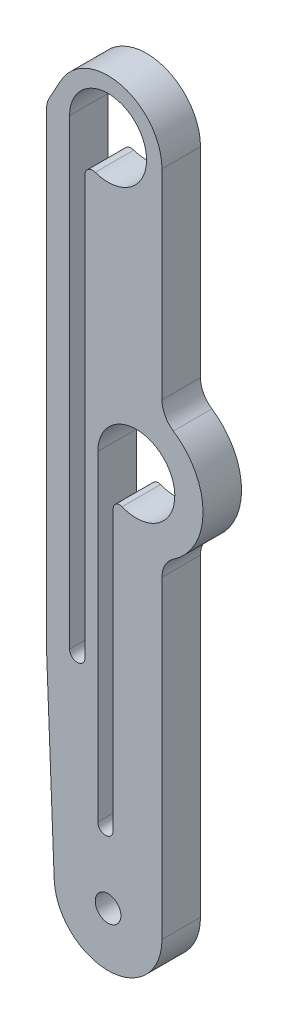
ISO-10303-21;
HEADER;
FILE_DESCRIPTION(('STEP AP214'),'2;1');
FILE_NAME('part.step','',(''),(''),'','','');
FILE_SCHEMA(('AUTOMOTIVE_DESIGN { 1 0 10303 214 1 1 1 1 }'));
ENDSEC;
DATA;
#1=APPLICATION_CONTEXT('core data for automotive mechanical design processes');
#2=APPLICATION_PROTOCOL_DEFINITION('international standard','automotive_design',2000,#1);
#3=PRODUCT_CONTEXT('',#1,'mechanical');
#4=PRODUCT('Part','Part','',(#3));
#5=PRODUCT_RELATED_PRODUCT_CATEGORY('part','',(#4));
#6=PRODUCT_DEFINITION_FORMATION('','',#4);
#7=PRODUCT_DEFINITION_CONTEXT('part definition',#1,'design');
#8=PRODUCT_DEFINITION('design','',#6,#7);
#9=PRODUCT_DEFINITION_SHAPE('','',#8);
#10=(LENGTH_UNIT() NAMED_UNIT(*) SI_UNIT(.MILLI.,.METRE.));
#11=(NAMED_UNIT(*) PLANE_ANGLE_UNIT() SI_UNIT($,.RADIAN.));
#12=(NAMED_UNIT(*) SI_UNIT($,.STERADIAN.) SOLID_ANGLE_UNIT());
#13=UNCERTAINTY_MEASURE_WITH_UNIT(LENGTH_MEASURE(1.E-05),#10,'distance_accuracy_value','');
#14=(GEOMETRIC_REPRESENTATION_CONTEXT(3) GLOBAL_UNCERTAINTY_ASSIGNED_CONTEXT((#13)) GLOBAL_UNIT_ASSIGNED_CONTEXT((#10,
#11,#12)) REPRESENTATION_CONTEXT('',''));
#15=CARTESIAN_POINT('',(0.,0.,0.));
#16=DIRECTION('',(0.,0.,1.));
#17=DIRECTION('',(1.,0.,0.));
#18=AXIS2_PLACEMENT_3D('',#15,#16,#17);
#19=CARTESIAN_POINT('',(-3.00172794621576,51.1319239030899,3.));
#20=DIRECTION('',(0.,0.,1.));
#21=DIRECTION('',(1.,0.,0.));
#22=AXIS2_PLACEMENT_3D('',#19,#20,#21);
#23=PLANE('',#22);
#24=DIRECTION('',(0.,-1.,0.));
#25=VECTOR('',#24,1.);
#26=CARTESIAN_POINT('',(-0.799999999999977,30.0333590932663,3.));
#27=LINE('',#26,#25);
#28=CARTESIAN_POINT('',(-0.799999999999977,30.0333590932663,3.));
#29=VERTEX_POINT('',#28);
#30=CARTESIAN_POINT('',(-0.799999999999977,5.03335909326628,3.));
#31=VERTEX_POINT('',#30);
#32=EDGE_CURVE('E186',#29,#31,#27,.T.);
#33=ORIENTED_EDGE('',*,*,#32,.F.);
#34=CARTESIAN_POINT('',(2.20000000000002,30.0333590932663,3.));
#35=DIRECTION('',(0.,0.,1.));
#36=DIRECTION('',(1.,0.,0.));
#37=AXIS2_PLACEMENT_3D('',#34,#35,#36);
#38=CIRCLE('',#37,3.);
#39=CARTESIAN_POINT('',(1.08571428571431,27.2479744973911,3.));
#40=VERTEX_POINT('',#39);
#41=EDGE_CURVE('E178',#40,#29,#38,.T.);
#42=ORIENTED_EDGE('',*,*,#41,.F.);
#43=CARTESIAN_POINT('',(0.900000000000023,26.7837437314119,3.));
#44=DIRECTION('',(0.,0.,-1.));
#45=DIRECTION('',(-1.,0.,0.));
#46=AXIS2_PLACEMENT_3D('',#43,#44,#45);
#47=CIRCLE('',#46,0.499999999999999);
#48=CARTESIAN_POINT('',(0.400000000000024,26.7837437314119,3.));
#49=VERTEX_POINT('',#48);
#50=EDGE_CURVE('E207',#49,#40,#47,.T.);
#51=ORIENTED_EDGE('',*,*,#50,.F.);
#52=DIRECTION('',(0.,1.,0.));
#53=VECTOR('',#52,1.);
#54=CARTESIAN_POINT('',(0.400000000000024,5.03335909326628,3.));
#55=LINE('',#54,#53);
#56=CARTESIAN_POINT('',(0.400000000000024,5.03335909326628,3.));
#57=VERTEX_POINT('',#56);
#58=EDGE_CURVE('E202',#57,#49,#55,.T.);
#59=ORIENTED_EDGE('',*,*,#58,.F.);
#60=CARTESIAN_POINT('',(-0.199999999999976,5.03335909326628,3.));
#61=DIRECTION('',(0.,0.,1.));
#62=DIRECTION('',(1.,0.,0.));
#63=AXIS2_PLACEMENT_3D('',#60,#61,#62);
#64=CIRCLE('',#63,0.600000000000001);
#65=EDGE_CURVE('E200',#31,#57,#64,.T.);
#66=ORIENTED_EDGE('',*,*,#65,.F.);
#67=EDGE_LOOP('',(#33,#42,#51,#59,#66));
#68=FACE_BOUND('',#67,.T.);
#69=DIRECTION('',(0.,1.,0.));
#70=VECTOR('',#69,1.);
#71=CARTESIAN_POINT('',(-1.79999999999998,15.6,3.));
#72=LINE('',#71,#70);
#73=CARTESIAN_POINT('',(-1.79999999999998,15.6,3.));
#74=VERTEX_POINT('',#73);
#75=CARTESIAN_POINT('',(-1.79999999999998,48.2058874503046,3.));
#76=VERTEX_POINT('',#75);
#77=EDGE_CURVE('E227',#74,#76,#72,.T.);
#78=ORIENTED_EDGE('',*,*,#77,.F.);
#79=CARTESIAN_POINT('',(-2.39999999999998,15.6,3.));
#80=DIRECTION('',(0.,0.,1.));
#81=DIRECTION('',(1.,0.,0.));
#82=AXIS2_PLACEMENT_3D('',#79,#80,#81);
#83=CIRCLE('',#82,0.600000000000001);
#84=CARTESIAN_POINT('',(-2.99999999999998,15.6,3.));
#85=VERTEX_POINT('',#84);
#86=EDGE_CURVE('E225',#85,#74,#83,.T.);
#87=ORIENTED_EDGE('',*,*,#86,.F.);
#88=DIRECTION('',(0.,-1.,0.));
#89=VECTOR('',#88,1.);
#90=CARTESIAN_POINT('',(-2.99999999999998,51.6,3.));
#91=LINE('',#90,#89);
#92=CARTESIAN_POINT('',(-2.99999999999998,51.6,3.));
#93=VERTEX_POINT('',#92);
#94=EDGE_CURVE('E235',#93,#85,#91,.T.);
#95=ORIENTED_EDGE('',*,*,#94,.F.);
#96=CARTESIAN_POINT('',(0.,51.6,3.));
#97=DIRECTION('',(0.,0.,1.));
#98=DIRECTION('',(1.,0.,0.));
#99=AXIS2_PLACEMENT_3D('',#96,#97,#98);
#100=CIRCLE('',#99,2.99999999999999);
#101=CARTESIAN_POINT('',(-0.999999999999981,48.7715728752538,3.));
#102=VERTEX_POINT('',#101);
#103=EDGE_CURVE('E232',#102,#93,#100,.T.);
#104=ORIENTED_EDGE('',*,*,#103,.F.);
#105=CARTESIAN_POINT('',(-1.19999999999998,48.2058874503046,3.));
#106=DIRECTION('',(0.,0.,-1.));
#107=DIRECTION('',(1.,0.,0.));
#108=AXIS2_PLACEMENT_3D('',#105,#106,#107);
#109=CIRCLE('',#108,0.6);
#110=EDGE_CURVE('E230',#76,#102,#109,.T.);
#111=ORIENTED_EDGE('',*,*,#110,.F.);
#112=EDGE_LOOP('',(#78,#87,#95,#104,#111));
#113=FACE_BOUND('',#112,.T.);
#114=CARTESIAN_POINT('',(-3.00172794621576,51.1319239030899,3.));
#115=DIRECTION('',(0.,0.,1.));
#116=DIRECTION('',(1.,0.,0.));
#117=AXIS2_PLACEMENT_3D('',#114,#115,#116);
#118=CIRCLE('',#117,1.8);
#119=CARTESIAN_POINT('',(-4.57481492065261,52.0067938196244,3.));
#120=VERTEX_POINT('',#119);
#121=CARTESIAN_POINT('',(-4.80172536810645,51.1349704071367,3.));
#122=VERTEX_POINT('',#121);
#123=EDGE_CURVE('E263',#120,#122,#118,.T.);
#124=ORIENTED_EDGE('',*,*,#123,.T.);
#125=DIRECTION('',(0.,-1.,0.));
#126=VECTOR('',#125,1.);
#127=CARTESIAN_POINT('',(-4.80172536810645,51.1349704071367,3.));
#128=LINE('',#127,#126);
#129=CARTESIAN_POINT('',(-4.80172536810645,14.8455166798283,3.));
#130=VERTEX_POINT('',#129);
#131=EDGE_CURVE('E266',#122,#130,#128,.T.);
#132=ORIENTED_EDGE('',*,*,#131,.T.);
#133=DIRECTION('',(0.0392265929449926,-0.999230341015488,0.));
#134=VECTOR('',#133,1.);
#135=CARTESIAN_POINT('',(-4.80172536810645,14.8455166798283,3.));
#136=LINE('',#135,#134);
#137=CARTESIAN_POINT('',(-4.19676743226505,-0.56475169036896,3.));
#138=VERTEX_POINT('',#137);
#139=EDGE_CURVE('E269',#130,#138,#136,.T.);
#140=ORIENTED_EDGE('',*,*,#139,.T.);
#141=CARTESIAN_POINT('',(0.,-0.399999999999998,3.));
#142=DIRECTION('',(0.,0.,1.));
#143=DIRECTION('',(1.,0.,0.));
#144=AXIS2_PLACEMENT_3D('',#141,#142,#143);
#145=CIRCLE('',#144,4.2);
#146=CARTESIAN_POINT('',(4.2,-0.399999999999998,3.));
#147=VERTEX_POINT('',#146);
#148=EDGE_CURVE('E271',#138,#147,#145,.T.);
#149=ORIENTED_EDGE('',*,*,#148,.T.);
#150=DIRECTION('',(0.,1.,0.));
#151=VECTOR('',#150,1.);
#152=CARTESIAN_POINT('',(4.2,-0.399999999999991,3.));
#153=LINE('',#152,#151);
#154=CARTESIAN_POINT('',(4.2,24.046707274428,3.));
#155=VERTEX_POINT('',#154);
#156=EDGE_CURVE('E273',#147,#155,#153,.T.);
#157=ORIENTED_EDGE('',*,*,#156,.T.);
#158=CARTESIAN_POINT('',(6.2,24.046707274428,3.));
#159=DIRECTION('',(0.,0.,-1.));
#160=DIRECTION('',(-1.,0.,0.));
#161=AXIS2_PLACEMENT_3D('',#158,#159,#160);
#162=CIRCLE('',#161,2.);
#163=CARTESIAN_POINT('',(5.0888888888889,25.7096661129942,3.));
#164=VERTEX_POINT('',#163);
#165=EDGE_CURVE('E275',#155,#164,#162,.T.);
#166=ORIENTED_EDGE('',*,*,#165,.T.);
#167=CARTESIAN_POINT('',(2.20000000000002,30.0333590932663,3.));
#168=DIRECTION('',(0.,0.,1.));
#169=DIRECTION('',(1.,0.,0.));
#170=AXIS2_PLACEMENT_3D('',#167,#168,#169);
#171=CIRCLE('',#170,5.2);
#172=CARTESIAN_POINT('',(5.0888888888889,34.3570520735384,3.));
#173=VERTEX_POINT('',#172);
#174=EDGE_CURVE('E277',#164,#173,#171,.T.);
#175=ORIENTED_EDGE('',*,*,#174,.T.);
#176=CARTESIAN_POINT('',(6.2,36.0200109121046,3.));
#177=DIRECTION('',(0.,0.,-1.));
#178=DIRECTION('',(1.,0.,0.));
#179=AXIS2_PLACEMENT_3D('',#176,#177,#178);
#180=CIRCLE('',#179,2.);
#181=CARTESIAN_POINT('',(4.2,36.0200109121046,3.));
#182=VERTEX_POINT('',#181);
#183=EDGE_CURVE('E279',#173,#182,#180,.T.);
#184=ORIENTED_EDGE('',*,*,#183,.T.);
#185=DIRECTION('',(0.,1.,0.));
#186=VECTOR('',#185,1.);
#187=CARTESIAN_POINT('',(4.2,47.4,3.));
#188=LINE('',#187,#186);
#189=CARTESIAN_POINT('',(4.2,51.6,3.));
#190=VERTEX_POINT('',#189);
#191=EDGE_CURVE('E281',#182,#190,#188,.T.);
#192=ORIENTED_EDGE('',*,*,#191,.T.);
#193=CARTESIAN_POINT('',(0.,51.6,3.));
#194=DIRECTION('',(0.,0.,1.));
#195=DIRECTION('',(1.,0.,0.));
#196=AXIS2_PLACEMENT_3D('',#193,#194,#195);
#197=CIRCLE('',#196,4.2);
#198=CARTESIAN_POINT('',(-3.70531896054088,53.5775265865865,3.));
#199=VERTEX_POINT('',#198);
#200=EDGE_CURVE('E283',#190,#199,#197,.T.);
#201=ORIENTED_EDGE('',*,*,#200,.T.);
#202=DIRECTION('',(-0.484308711135834,-0.87489717814035,0.));
#203=VECTOR('',#202,1.);
#204=CARTESIAN_POINT('',(-3.70531896054087,53.5775265865865,3.));
#205=LINE('',#204,#203);
#206=EDGE_CURVE('E285',#199,#120,#205,.T.);
#207=ORIENTED_EDGE('',*,*,#206,.T.);
#208=EDGE_LOOP('',(#124,#132,#140,#149,#157,#166,#175,#184,#192,#201,#207));
#209=FACE_BOUND('',#208,.T.);
#210=CARTESIAN_POINT('',(0.,-0.399999999999998,3.));
#211=DIRECTION('',(0.,0.,1.));
#212=DIRECTION('',(1.,0.,0.));
#213=AXIS2_PLACEMENT_3D('',#210,#211,#212);
#214=CIRCLE('',#213,1.);
#215=CARTESIAN_POINT('',(1.,-0.399999999999998,3.));
#216=VERTEX_POINT('',#215);
#217=EDGE_CURVE('E210',#216,#216,#214,.T.);
#218=ORIENTED_EDGE('',*,*,#217,.F.);
#219=EDGE_LOOP('',(#218));
#220=FACE_BOUND('',#219,.T.);
#221=ADVANCED_FACE('F35',(#68,#113,#209,#220),#23,.T.);
#222=CARTESIAN_POINT('',(-3.00172794621576,51.1319239030899,0.));
#223=DIRECTION('',(0.,0.,1.));
#224=DIRECTION('',(1.,0.,0.));
#225=AXIS2_PLACEMENT_3D('',#222,#223,#224);
#226=PLANE('',#225);
#227=CARTESIAN_POINT('',(-2.39999999999998,15.6,0.));
#228=DIRECTION('',(0.,0.,1.));
#229=DIRECTION('',(1.,0.,0.));
#230=AXIS2_PLACEMENT_3D('',#227,#228,#229);
#231=CIRCLE('',#230,0.600000000000001);
#232=CARTESIAN_POINT('',(-2.99999999999998,15.6,0.));
#233=VERTEX_POINT('',#232);
#234=CARTESIAN_POINT('',(-1.79999999999998,15.6,0.));
#235=VERTEX_POINT('',#234);
#236=EDGE_CURVE('E194',#233,#235,#231,.T.);
#237=ORIENTED_EDGE('',*,*,#236,.T.);
#238=DIRECTION('',(0.,1.,0.));
#239=VECTOR('',#238,1.);
#240=CARTESIAN_POINT('',(-1.79999999999998,15.6,0.));
#241=LINE('',#240,#239);
#242=CARTESIAN_POINT('',(-1.79999999999998,48.2058874503046,0.));
#243=VERTEX_POINT('',#242);
#244=EDGE_CURVE('E240',#235,#243,#241,.T.);
#245=ORIENTED_EDGE('',*,*,#244,.T.);
#246=CARTESIAN_POINT('',(-1.19999999999998,48.2058874503046,0.));
#247=DIRECTION('',(0.,0.,-1.));
#248=DIRECTION('',(1.,0.,0.));
#249=AXIS2_PLACEMENT_3D('',#246,#247,#248);
#250=CIRCLE('',#249,0.6);
#251=CARTESIAN_POINT('',(-0.999999999999981,48.7715728752538,0.));
#252=VERTEX_POINT('',#251);
#253=EDGE_CURVE('E243',#243,#252,#250,.T.);
#254=ORIENTED_EDGE('',*,*,#253,.T.);
#255=CARTESIAN_POINT('',(0.,51.6,0.));
#256=DIRECTION('',(0.,0.,1.));
#257=DIRECTION('',(1.,0.,0.));
#258=AXIS2_PLACEMENT_3D('',#255,#256,#257);
#259=CIRCLE('',#258,2.99999999999999);
#260=CARTESIAN_POINT('',(-2.99999999999999,51.6,0.));
#261=VERTEX_POINT('',#260);
#262=EDGE_CURVE('E246',#252,#261,#259,.T.);
#263=ORIENTED_EDGE('',*,*,#262,.T.);
#264=DIRECTION('',(0.,-1.,0.));
#265=VECTOR('',#264,1.);
#266=CARTESIAN_POINT('',(-2.99999999999998,51.6,0.));
#267=LINE('',#266,#265);
#268=EDGE_CURVE('E228',#261,#233,#267,.T.);
#269=ORIENTED_EDGE('',*,*,#268,.T.);
#270=EDGE_LOOP('',(#237,#245,#254,#263,#269));
#271=FACE_BOUND('',#270,.T.);
#272=CARTESIAN_POINT('',(-3.00172794621576,51.1319239030899,0.));
#273=DIRECTION('',(0.,0.,1.));
#274=DIRECTION('',(1.,0.,0.));
#275=AXIS2_PLACEMENT_3D('',#272,#273,#274);
#276=CIRCLE('',#275,1.8);
#277=CARTESIAN_POINT('',(-4.57481492065261,52.0067938196244,0.));
#278=VERTEX_POINT('',#277);
#279=CARTESIAN_POINT('',(-4.80172536810645,51.1349704071367,0.));
#280=VERTEX_POINT('',#279);
#281=EDGE_CURVE('E262',#278,#280,#276,.T.);
#282=ORIENTED_EDGE('',*,*,#281,.F.);
#283=DIRECTION('',(-0.484308711135834,-0.87489717814035,0.));
#284=VECTOR('',#283,1.);
#285=CARTESIAN_POINT('',(-3.70531896054087,53.5775265865865,0.));
#286=LINE('',#285,#284);
#287=CARTESIAN_POINT('',(-3.70531896054088,53.5775265865865,0.));
#288=VERTEX_POINT('',#287);
#289=EDGE_CURVE('E267',#288,#278,#286,.T.);
#290=ORIENTED_EDGE('',*,*,#289,.F.);
#291=CARTESIAN_POINT('',(0.,51.6,0.));
#292=DIRECTION('',(0.,0.,1.));
#293=DIRECTION('',(1.,0.,0.));
#294=AXIS2_PLACEMENT_3D('',#291,#292,#293);
#295=CIRCLE('',#294,4.2);
#296=CARTESIAN_POINT('',(4.2,51.6,0.));
#297=VERTEX_POINT('',#296);
#298=EDGE_CURVE('E308',#297,#288,#295,.T.);
#299=ORIENTED_EDGE('',*,*,#298,.F.);
#300=DIRECTION('',(0.,1.,0.));
#301=VECTOR('',#300,1.);
#302=CARTESIAN_POINT('',(4.2,47.4,0.));
#303=LINE('',#302,#301);
#304=CARTESIAN_POINT('',(4.2,36.0200109121046,0.));
#305=VERTEX_POINT('',#304);
#306=EDGE_CURVE('E306',#305,#297,#303,.T.);
#307=ORIENTED_EDGE('',*,*,#306,.F.);
#308=CARTESIAN_POINT('',(6.2,36.0200109121046,0.));
#309=DIRECTION('',(0.,0.,-1.));
#310=DIRECTION('',(1.,0.,0.));
#311=AXIS2_PLACEMENT_3D('',#308,#309,#310);
#312=CIRCLE('',#311,2.);
#313=CARTESIAN_POINT('',(5.0888888888889,34.3570520735384,0.));
#314=VERTEX_POINT('',#313);
#315=EDGE_CURVE('E303',#314,#305,#312,.T.);
#316=ORIENTED_EDGE('',*,*,#315,.F.);
#317=CARTESIAN_POINT('',(2.20000000000002,30.0333590932663,0.));
#318=DIRECTION('',(0.,0.,1.));
#319=DIRECTION('',(1.,0.,0.));
#320=AXIS2_PLACEMENT_3D('',#317,#318,#319);
#321=CIRCLE('',#320,5.2);
#322=CARTESIAN_POINT('',(5.0888888888889,25.7096661129942,0.));
#323=VERTEX_POINT('',#322);
#324=EDGE_CURVE('E301',#323,#314,#321,.T.);
#325=ORIENTED_EDGE('',*,*,#324,.F.);
#326=CARTESIAN_POINT('',(6.2,24.046707274428,0.));
#327=DIRECTION('',(0.,0.,-1.));
#328=DIRECTION('',(-1.,0.,0.));
#329=AXIS2_PLACEMENT_3D('',#326,#327,#328);
#330=CIRCLE('',#329,2.);
#331=CARTESIAN_POINT('',(4.2,24.046707274428,0.));
#332=VERTEX_POINT('',#331);
#333=EDGE_CURVE('E299',#332,#323,#330,.T.);
#334=ORIENTED_EDGE('',*,*,#333,.F.);
#335=DIRECTION('',(0.,1.,0.));
#336=VECTOR('',#335,1.);
#337=CARTESIAN_POINT('',(4.2,24.046707274428,0.));
#338=LINE('',#337,#336);
#339=CARTESIAN_POINT('',(4.2,-0.399999999999998,0.));
#340=VERTEX_POINT('',#339);
#341=EDGE_CURVE('E297',#340,#332,#338,.T.);
#342=ORIENTED_EDGE('',*,*,#341,.F.);
#343=CARTESIAN_POINT('',(0.,-0.399999999999998,0.));
#344=DIRECTION('',(0.,0.,1.));
#345=DIRECTION('',(1.,0.,0.));
#346=AXIS2_PLACEMENT_3D('',#343,#344,#345);
#347=CIRCLE('',#346,4.2);
#348=CARTESIAN_POINT('',(-4.19676743226505,-0.56475169036896,0.));
#349=VERTEX_POINT('',#348);
#350=EDGE_CURVE('E294',#349,#340,#347,.T.);
#351=ORIENTED_EDGE('',*,*,#350,.F.);
#352=DIRECTION('',(0.0392265929449926,-0.999230341015488,0.));
#353=VECTOR('',#352,1.);
#354=CARTESIAN_POINT('',(-4.80172536810645,14.8455166798283,0.));
#355=LINE('',#354,#353);
#356=CARTESIAN_POINT('',(-4.80172536810645,14.8455166798283,0.));
#357=VERTEX_POINT('',#356);
#358=EDGE_CURVE('E292',#357,#349,#355,.T.);
#359=ORIENTED_EDGE('',*,*,#358,.F.);
#360=DIRECTION('',(0.,-1.,0.));
#361=VECTOR('',#360,1.);
#362=CARTESIAN_POINT('',(-4.80172536810645,51.1349704071367,0.));
#363=LINE('',#362,#361);
#364=EDGE_CURVE('E290',#280,#357,#363,.T.);
#365=ORIENTED_EDGE('',*,*,#364,.F.);
#366=EDGE_LOOP('',(#282,#290,#299,#307,#316,#325,#334,#342,#351,#359,#365));
#367=FACE_BOUND('',#366,.T.);
#368=CARTESIAN_POINT('',(2.20000000000002,30.0333590932663,0.));
#369=DIRECTION('',(0.,0.,1.));
#370=DIRECTION('',(1.,0.,0.));
#371=AXIS2_PLACEMENT_3D('',#368,#369,#370);
#372=CIRCLE('',#371,3.);
#373=CARTESIAN_POINT('',(1.08571428571431,27.2479744973911,0.));
#374=VERTEX_POINT('',#373);
#375=CARTESIAN_POINT('',(-0.799999999999977,30.0333590932663,0.));
#376=VERTEX_POINT('',#375);
#377=EDGE_CURVE('E58',#374,#376,#372,.T.);
#378=ORIENTED_EDGE('',*,*,#377,.T.);
#379=DIRECTION('',(0.,-1.,0.));
#380=VECTOR('',#379,1.);
#381=CARTESIAN_POINT('',(-0.799999999999977,30.0333590932663,0.));
#382=LINE('',#381,#380);
#383=CARTESIAN_POINT('',(-0.799999999999977,5.03335909326628,0.));
#384=VERTEX_POINT('',#383);
#385=EDGE_CURVE('E193',#376,#384,#382,.T.);
#386=ORIENTED_EDGE('',*,*,#385,.T.);
#387=CARTESIAN_POINT('',(-0.199999999999976,5.03335909326628,0.));
#388=DIRECTION('',(0.,0.,1.));
#389=DIRECTION('',(1.,0.,0.));
#390=AXIS2_PLACEMENT_3D('',#387,#388,#389);
#391=CIRCLE('',#390,0.600000000000001);
#392=CARTESIAN_POINT('',(0.400000000000024,5.03335909326628,0.));
#393=VERTEX_POINT('',#392);
#394=EDGE_CURVE('E212',#384,#393,#391,.T.);
#395=ORIENTED_EDGE('',*,*,#394,.T.);
#396=DIRECTION('',(0.,1.,0.));
#397=VECTOR('',#396,1.);
#398=CARTESIAN_POINT('',(0.400000000000024,5.03335909326628,0.));
#399=LINE('',#398,#397);
#400=CARTESIAN_POINT('',(0.400000000000023,26.7837437314119,0.));
#401=VERTEX_POINT('',#400);
#402=EDGE_CURVE('E215',#393,#401,#399,.T.);
#403=ORIENTED_EDGE('',*,*,#402,.T.);
#404=CARTESIAN_POINT('',(0.900000000000023,26.7837437314119,0.));
#405=DIRECTION('',(0.,0.,-1.));
#406=DIRECTION('',(-1.,0.,0.));
#407=AXIS2_PLACEMENT_3D('',#404,#405,#406);
#408=CIRCLE('',#407,0.499999999999999);
#409=EDGE_CURVE('E187',#401,#374,#408,.T.);
#410=ORIENTED_EDGE('',*,*,#409,.T.);
#411=EDGE_LOOP('',(#378,#386,#395,#403,#410));
#412=FACE_BOUND('',#411,.T.);
#413=CARTESIAN_POINT('',(0.,-0.399999999999998,0.));
#414=DIRECTION('',(0.,0.,1.));
#415=DIRECTION('',(1.,0.,0.));
#416=AXIS2_PLACEMENT_3D('',#413,#414,#415);
#417=CIRCLE('',#416,1.);
#418=CARTESIAN_POINT('',(1.,-0.399999999999998,0.));
#419=VERTEX_POINT('',#418);
#420=EDGE_CURVE('E611',#419,#419,#417,.T.);
#421=ORIENTED_EDGE('',*,*,#420,.T.);
#422=EDGE_LOOP('',(#421));
#423=FACE_BOUND('',#422,.T.);
#424=ADVANCED_FACE('F347',(#271,#367,#412,#423),#226,.F.);
#425=CARTESIAN_POINT('',(-3.00172794621576,51.1319239030899,3.));
#426=DIRECTION('',(0.,0.,-1.));
#427=DIRECTION('',(-1.,0.,0.));
#428=AXIS2_PLACEMENT_3D('',#425,#426,#427);
#429=CYLINDRICAL_SURFACE('',#428,1.8);
#430=ORIENTED_EDGE('',*,*,#281,.T.);
#431=DIRECTION('',(0.,0.,-1.));
#432=VECTOR('',#431,1.);
#433=CARTESIAN_POINT('',(-4.80172536810645,51.1349704071367,3.));
#434=LINE('',#433,#432);
#435=EDGE_CURVE('E11',#122,#280,#434,.T.);
#436=ORIENTED_EDGE('',*,*,#435,.F.);
#437=ORIENTED_EDGE('',*,*,#123,.F.);
#438=DIRECTION('',(0.,0.,-1.));
#439=VECTOR('',#438,1.);
#440=CARTESIAN_POINT('',(-4.57481492065261,52.0067938196244,3.));
#441=LINE('',#440,#439);
#442=EDGE_CURVE('E287',#120,#278,#441,.T.);
#443=ORIENTED_EDGE('',*,*,#442,.T.);
#444=EDGE_LOOP('',(#430,#436,#437,#443));
#445=FACE_BOUND('',#444,.T.);
#446=ADVANCED_FACE('F37',(#445),#429,.T.);
#447=CARTESIAN_POINT('',(-4.80172536810645,51.1349704071367,3.));
#448=DIRECTION('',(1.,0.,0.));
#449=DIRECTION('',(0.,0.,-1.));
#450=AXIS2_PLACEMENT_3D('',#447,#448,#449);
#451=PLANE('',#450);
#452=ORIENTED_EDGE('',*,*,#364,.T.);
#453=DIRECTION('',(0.,0.,-1.));
#454=VECTOR('',#453,1.);
#455=CARTESIAN_POINT('',(-4.80172536810645,14.8455166798283,3.));
#456=LINE('',#455,#454);
#457=EDGE_CURVE('E43',#130,#357,#456,.T.);
#458=ORIENTED_EDGE('',*,*,#457,.F.);
#459=ORIENTED_EDGE('',*,*,#131,.F.);
#460=ORIENTED_EDGE('',*,*,#435,.T.);
#461=EDGE_LOOP('',(#452,#458,#459,#460));
#462=FACE_BOUND('',#461,.T.);
#463=ADVANCED_FACE('F364',(#462),#451,.F.);
#464=CARTESIAN_POINT('',(-4.80172536810645,14.8455166798283,3.));
#465=DIRECTION('',(0.999230341015488,0.0392265929449926,0.));
#466=DIRECTION('',(-0.0392265929449926,0.999230341015488,0.));
#467=AXIS2_PLACEMENT_3D('',#464,#465,#466);
#468=PLANE('',#467);
#469=ORIENTED_EDGE('',*,*,#358,.T.);
#470=DIRECTION('',(0.,0.,-1.));
#471=VECTOR('',#470,1.);
#472=CARTESIAN_POINT('',(-4.19676743226505,-0.56475169036896,3.));
#473=LINE('',#472,#471);
#474=EDGE_CURVE('E334',#138,#349,#473,.T.);
#475=ORIENTED_EDGE('',*,*,#474,.F.);
#476=ORIENTED_EDGE('',*,*,#139,.F.);
#477=ORIENTED_EDGE('',*,*,#457,.T.);
#478=EDGE_LOOP('',(#469,#475,#476,#477));
#479=FACE_BOUND('',#478,.T.);
#480=ADVANCED_FACE('F341',(#479),#468,.F.);
#481=CARTESIAN_POINT('',(0.,-0.399999999999998,3.));
#482=DIRECTION('',(0.,0.,-1.));
#483=DIRECTION('',(-1.,0.,0.));
#484=AXIS2_PLACEMENT_3D('',#481,#482,#483);
#485=CYLINDRICAL_SURFACE('',#484,4.2);
#486=ORIENTED_EDGE('',*,*,#350,.T.);
#487=DIRECTION('',(0.,0.,-1.));
#488=VECTOR('',#487,1.);
#489=CARTESIAN_POINT('',(4.2,-0.399999999999998,3.));
#490=LINE('',#489,#488);
#491=EDGE_CURVE('E331',#147,#340,#490,.T.);
#492=ORIENTED_EDGE('',*,*,#491,.F.);
#493=ORIENTED_EDGE('',*,*,#148,.F.);
#494=ORIENTED_EDGE('',*,*,#474,.T.);
#495=EDGE_LOOP('',(#486,#492,#493,#494));
#496=FACE_BOUND('',#495,.T.);
#497=ADVANCED_FACE('F352',(#496),#485,.T.);
#498=CARTESIAN_POINT('',(4.2,24.046707274428,3.));
#499=DIRECTION('',(-1.,0.,0.));
#500=DIRECTION('',(0.,0.,1.));
#501=AXIS2_PLACEMENT_3D('',#498,#499,#500);
#502=PLANE('',#501);
#503=ORIENTED_EDGE('',*,*,#341,.T.);
#504=DIRECTION('',(0.,0.,-1.));
#505=VECTOR('',#504,1.);
#506=CARTESIAN_POINT('',(4.2,24.046707274428,3.));
#507=LINE('',#506,#505);
#508=EDGE_CURVE('E328',#155,#332,#507,.T.);
#509=ORIENTED_EDGE('',*,*,#508,.F.);
#510=ORIENTED_EDGE('',*,*,#156,.F.);
#511=ORIENTED_EDGE('',*,*,#491,.T.);
#512=EDGE_LOOP('',(#503,#509,#510,#511));
#513=FACE_BOUND('',#512,.T.);
#514=ADVANCED_FACE('F356',(#513),#502,.F.);
#515=CARTESIAN_POINT('',(6.2,24.046707274428,3.));
#516=DIRECTION('',(0.,0.,-1.));
#517=DIRECTION('',(-1.,0.,0.));
#518=AXIS2_PLACEMENT_3D('',#515,#516,#517);
#519=CYLINDRICAL_SURFACE('',#518,2.);
#520=ORIENTED_EDGE('',*,*,#333,.T.);
#521=DIRECTION('',(0.,0.,-1.));
#522=VECTOR('',#521,1.);
#523=CARTESIAN_POINT('',(5.0888888888889,25.7096661129942,3.));
#524=LINE('',#523,#522);
#525=EDGE_CURVE('E325',#164,#323,#524,.T.);
#526=ORIENTED_EDGE('',*,*,#525,.F.);
#527=ORIENTED_EDGE('',*,*,#165,.F.);
#528=ORIENTED_EDGE('',*,*,#508,.T.);
#529=EDGE_LOOP('',(#520,#526,#527,#528));
#530=FACE_BOUND('',#529,.T.);
#531=ADVANCED_FACE('F391',(#530),#519,.F.);
#532=CARTESIAN_POINT('',(2.20000000000002,30.0333590932663,3.));
#533=DIRECTION('',(0.,0.,-1.));
#534=DIRECTION('',(-1.,0.,0.));
#535=AXIS2_PLACEMENT_3D('',#532,#533,#534);
#536=CYLINDRICAL_SURFACE('',#535,5.2);
#537=ORIENTED_EDGE('',*,*,#324,.T.);
#538=DIRECTION('',(0.,0.,-1.));
#539=VECTOR('',#538,1.);
#540=CARTESIAN_POINT('',(5.0888888888889,34.3570520735384,3.));
#541=LINE('',#540,#539);
#542=EDGE_CURVE('E322',#173,#314,#541,.T.);
#543=ORIENTED_EDGE('',*,*,#542,.F.);
#544=ORIENTED_EDGE('',*,*,#174,.F.);
#545=ORIENTED_EDGE('',*,*,#525,.T.);
#546=EDGE_LOOP('',(#537,#543,#544,#545));
#547=FACE_BOUND('',#546,.T.);
#548=ADVANCED_FACE('F389',(#547),#536,.T.);
#549=CARTESIAN_POINT('',(6.2,36.0200109121046,3.));
#550=DIRECTION('',(0.,0.,-1.));
#551=DIRECTION('',(-1.,0.,0.));
#552=AXIS2_PLACEMENT_3D('',#549,#550,#551);
#553=CYLINDRICAL_SURFACE('',#552,2.);
#554=ORIENTED_EDGE('',*,*,#315,.T.);
#555=DIRECTION('',(0.,0.,-1.));
#556=VECTOR('',#555,1.);
#557=CARTESIAN_POINT('',(4.2,36.0200109121046,3.));
#558=LINE('',#557,#556);
#559=EDGE_CURVE('E319',#182,#305,#558,.T.);
#560=ORIENTED_EDGE('',*,*,#559,.F.);
#561=ORIENTED_EDGE('',*,*,#183,.F.);
#562=ORIENTED_EDGE('',*,*,#542,.T.);
#563=EDGE_LOOP('',(#554,#560,#561,#562));
#564=FACE_BOUND('',#563,.T.);
#565=ADVANCED_FACE('F384',(#564),#553,.F.);
#566=CARTESIAN_POINT('',(4.2,47.4,3.));
#567=DIRECTION('',(-1.,0.,0.));
#568=DIRECTION('',(0.,0.,1.));
#569=AXIS2_PLACEMENT_3D('',#566,#567,#568);
#570=PLANE('',#569);
#571=ORIENTED_EDGE('',*,*,#306,.T.);
#572=DIRECTION('',(0.,0.,-1.));
#573=VECTOR('',#572,1.);
#574=CARTESIAN_POINT('',(4.2,51.6,3.));
#575=LINE('',#574,#573);
#576=EDGE_CURVE('E316',#190,#297,#575,.T.);
#577=ORIENTED_EDGE('',*,*,#576,.F.);
#578=ORIENTED_EDGE('',*,*,#191,.F.);
#579=ORIENTED_EDGE('',*,*,#559,.T.);
#580=EDGE_LOOP('',(#571,#577,#578,#579));
#581=FACE_BOUND('',#580,.T.);
#582=ADVANCED_FACE('F379',(#581),#570,.F.);
#583=CARTESIAN_POINT('',(0.,51.6,3.));
#584=DIRECTION('',(0.,0.,-1.));
#585=DIRECTION('',(-1.,0.,0.));
#586=AXIS2_PLACEMENT_3D('',#583,#584,#585);
#587=CYLINDRICAL_SURFACE('',#586,4.2);
#588=ORIENTED_EDGE('',*,*,#298,.T.);
#589=DIRECTION('',(0.,0.,-1.));
#590=VECTOR('',#589,1.);
#591=CARTESIAN_POINT('',(-3.70531896054088,53.5775265865865,3.));
#592=LINE('',#591,#590);
#593=EDGE_CURVE('E313',#199,#288,#592,.T.);
#594=ORIENTED_EDGE('',*,*,#593,.F.);
#595=ORIENTED_EDGE('',*,*,#200,.F.);
#596=ORIENTED_EDGE('',*,*,#576,.T.);
#597=EDGE_LOOP('',(#588,#594,#595,#596));
#598=FACE_BOUND('',#597,.T.);
#599=ADVANCED_FACE('F375',(#598),#587,.T.);
#600=CARTESIAN_POINT('',(-3.70531896054087,53.5775265865865,3.));
#601=DIRECTION('',(0.87489717814035,-0.484308711135834,0.));
#602=DIRECTION('',(0.484308711135834,0.87489717814035,0.));
#603=AXIS2_PLACEMENT_3D('',#600,#601,#602);
#604=PLANE('',#603);
#605=ORIENTED_EDGE('',*,*,#289,.T.);
#606=ORIENTED_EDGE('',*,*,#442,.F.);
#607=ORIENTED_EDGE('',*,*,#206,.F.);
#608=ORIENTED_EDGE('',*,*,#593,.T.);
#609=EDGE_LOOP('',(#605,#606,#607,#608));
#610=FACE_BOUND('',#609,.T.);
#611=ADVANCED_FACE('F370',(#610),#604,.F.);
#612=CARTESIAN_POINT('',(-2.39999999999998,15.6,3.));
#613=DIRECTION('',(0.,0.,-1.));
#614=DIRECTION('',(-1.,0.,0.));
#615=AXIS2_PLACEMENT_3D('',#612,#613,#614);
#616=CYLINDRICAL_SURFACE('',#615,0.600000000000001);
#617=ORIENTED_EDGE('',*,*,#236,.F.);
#618=DIRECTION('',(0.,0.,-1.));
#619=VECTOR('',#618,1.);
#620=CARTESIAN_POINT('',(-2.99999999999998,15.6,3.));
#621=LINE('',#620,#619);
#622=EDGE_CURVE('E237',#85,#233,#621,.T.);
#623=ORIENTED_EDGE('',*,*,#622,.F.);
#624=ORIENTED_EDGE('',*,*,#86,.T.);
#625=DIRECTION('',(0.,0.,-1.));
#626=VECTOR('',#625,1.);
#627=CARTESIAN_POINT('',(-1.79999999999998,15.6,3.));
#628=LINE('',#627,#626);
#629=EDGE_CURVE('E259',#74,#235,#628,.T.);
#630=ORIENTED_EDGE('',*,*,#629,.T.);
#631=EDGE_LOOP('',(#617,#623,#624,#630));
#632=FACE_BOUND('',#631,.T.);
#633=ADVANCED_FACE('F408',(#632),#616,.F.);
#634=CARTESIAN_POINT('',(-1.79999999999998,15.6,3.));
#635=DIRECTION('',(-1.,0.,0.));
#636=DIRECTION('',(0.,0.,1.));
#637=AXIS2_PLACEMENT_3D('',#634,#635,#636);
#638=PLANE('',#637);
#639=ORIENTED_EDGE('',*,*,#244,.F.);
#640=ORIENTED_EDGE('',*,*,#629,.F.);
#641=ORIENTED_EDGE('',*,*,#77,.T.);
#642=DIRECTION('',(0.,0.,-1.));
#643=VECTOR('',#642,1.);
#644=CARTESIAN_POINT('',(-1.79999999999998,48.2058874503046,3.));
#645=LINE('',#644,#643);
#646=EDGE_CURVE('E257',#76,#243,#645,.T.);
#647=ORIENTED_EDGE('',*,*,#646,.T.);
#648=EDGE_LOOP('',(#639,#640,#641,#647));
#649=FACE_BOUND('',#648,.T.);
#650=ADVANCED_FACE('F440',(#649),#638,.T.);
#651=CARTESIAN_POINT('',(-1.19999999999998,48.2058874503046,3.));
#652=DIRECTION('',(0.,0.,-1.));
#653=DIRECTION('',(-1.,0.,0.));
#654=AXIS2_PLACEMENT_3D('',#651,#652,#653);
#655=CYLINDRICAL_SURFACE('',#654,0.6);
#656=ORIENTED_EDGE('',*,*,#253,.F.);
#657=ORIENTED_EDGE('',*,*,#646,.F.);
#658=ORIENTED_EDGE('',*,*,#110,.T.);
#659=DIRECTION('',(0.,0.,-1.));
#660=VECTOR('',#659,1.);
#661=CARTESIAN_POINT('',(-0.999999999999981,48.7715728752538,3.));
#662=LINE('',#661,#660);
#663=EDGE_CURVE('E255',#102,#252,#662,.T.);
#664=ORIENTED_EDGE('',*,*,#663,.T.);
#665=EDGE_LOOP('',(#656,#657,#658,#664));
#666=FACE_BOUND('',#665,.T.);
#667=ADVANCED_FACE('F447',(#666),#655,.T.);
#668=CARTESIAN_POINT('',(0.,51.6,3.));
#669=DIRECTION('',(0.,0.,-1.));
#670=DIRECTION('',(-1.,0.,0.));
#671=AXIS2_PLACEMENT_3D('',#668,#669,#670);
#672=CYLINDRICAL_SURFACE('',#671,2.99999999999999);
#673=ORIENTED_EDGE('',*,*,#262,.F.);
#674=ORIENTED_EDGE('',*,*,#663,.F.);
#675=ORIENTED_EDGE('',*,*,#103,.T.);
#676=DIRECTION('',(0.,0.,-1.));
#677=VECTOR('',#676,1.);
#678=CARTESIAN_POINT('',(-2.99999999999999,51.6,3.));
#679=LINE('',#678,#677);
#680=EDGE_CURVE('E253',#93,#261,#679,.T.);
#681=ORIENTED_EDGE('',*,*,#680,.T.);
#682=EDGE_LOOP('',(#673,#674,#675,#681));
#683=FACE_BOUND('',#682,.T.);
#684=ADVANCED_FACE('F454',(#683),#672,.F.);
#685=CARTESIAN_POINT('',(-2.99999999999998,51.6,3.));
#686=DIRECTION('',(1.,0.,0.));
#687=DIRECTION('',(0.,0.,-1.));
#688=AXIS2_PLACEMENT_3D('',#685,#686,#687);
#689=PLANE('',#688);
#690=ORIENTED_EDGE('',*,*,#268,.F.);
#691=ORIENTED_EDGE('',*,*,#680,.F.);
#692=ORIENTED_EDGE('',*,*,#94,.T.);
#693=ORIENTED_EDGE('',*,*,#622,.T.);
#694=EDGE_LOOP('',(#690,#691,#692,#693));
#695=FACE_BOUND('',#694,.T.);
#696=ADVANCED_FACE('F462',(#695),#689,.T.);
#697=CARTESIAN_POINT('',(2.20000000000002,30.0333590932663,3.));
#698=DIRECTION('',(0.,0.,-1.));
#699=DIRECTION('',(-1.,0.,0.));
#700=AXIS2_PLACEMENT_3D('',#697,#698,#699);
#701=CYLINDRICAL_SURFACE('',#700,3.);
#702=ORIENTED_EDGE('',*,*,#377,.F.);
#703=DIRECTION('',(0.,0.,-1.));
#704=VECTOR('',#703,1.);
#705=CARTESIAN_POINT('',(1.08571428571431,27.2479744973911,3.));
#706=LINE('',#705,#704);
#707=EDGE_CURVE('E182',#40,#374,#706,.T.);
#708=ORIENTED_EDGE('',*,*,#707,.F.);
#709=ORIENTED_EDGE('',*,*,#41,.T.);
#710=DIRECTION('',(0.,0.,-1.));
#711=VECTOR('',#710,1.);
#712=CARTESIAN_POINT('',(-0.799999999999977,30.0333590932663,3.));
#713=LINE('',#712,#711);
#714=EDGE_CURVE('E181',#29,#376,#713,.T.);
#715=ORIENTED_EDGE('',*,*,#714,.T.);
#716=EDGE_LOOP('',(#702,#708,#709,#715));
#717=FACE_BOUND('',#716,.T.);
#718=ADVANCED_FACE('F180',(#717),#701,.F.);
#719=CARTESIAN_POINT('',(-0.799999999999977,30.0333590932663,3.));
#720=DIRECTION('',(1.,0.,0.));
#721=DIRECTION('',(0.,0.,-1.));
#722=AXIS2_PLACEMENT_3D('',#719,#720,#721);
#723=PLANE('',#722);
#724=ORIENTED_EDGE('',*,*,#385,.F.);
#725=ORIENTED_EDGE('',*,*,#714,.F.);
#726=ORIENTED_EDGE('',*,*,#32,.T.);
#727=DIRECTION('',(0.,0.,-1.));
#728=VECTOR('',#727,1.);
#729=CARTESIAN_POINT('',(-0.799999999999977,5.03335909326628,3.));
#730=LINE('',#729,#728);
#731=EDGE_CURVE('E195',#31,#384,#730,.T.);
#732=ORIENTED_EDGE('',*,*,#731,.T.);
#733=EDGE_LOOP('',(#724,#725,#726,#732));
#734=FACE_BOUND('',#733,.T.);
#735=ADVANCED_FACE('F190',(#734),#723,.T.);
#736=CARTESIAN_POINT('',(-0.199999999999976,5.03335909326628,3.));
#737=DIRECTION('',(0.,0.,-1.));
#738=DIRECTION('',(-1.,0.,0.));
#739=AXIS2_PLACEMENT_3D('',#736,#737,#738);
#740=CYLINDRICAL_SURFACE('',#739,0.600000000000001);
#741=ORIENTED_EDGE('',*,*,#394,.F.);
#742=ORIENTED_EDGE('',*,*,#731,.F.);
#743=ORIENTED_EDGE('',*,*,#65,.T.);
#744=DIRECTION('',(0.,0.,-1.));
#745=VECTOR('',#744,1.);
#746=CARTESIAN_POINT('',(0.400000000000024,5.03335909326628,3.));
#747=LINE('',#746,#745);
#748=EDGE_CURVE('E222',#57,#393,#747,.T.);
#749=ORIENTED_EDGE('',*,*,#748,.T.);
#750=EDGE_LOOP('',(#741,#742,#743,#749));
#751=FACE_BOUND('',#750,.T.);
#752=ADVANCED_FACE('F483',(#751),#740,.F.);
#753=CARTESIAN_POINT('',(0.400000000000024,5.03335909326628,3.));
#754=DIRECTION('',(-1.,0.,0.));
#755=DIRECTION('',(0.,-1.,0.));
#756=AXIS2_PLACEMENT_3D('',#753,#754,#755);
#757=PLANE('',#756);
#758=ORIENTED_EDGE('',*,*,#402,.F.);
#759=ORIENTED_EDGE('',*,*,#748,.F.);
#760=ORIENTED_EDGE('',*,*,#58,.T.);
#761=DIRECTION('',(0.,0.,-1.));
#762=VECTOR('',#761,1.);
#763=CARTESIAN_POINT('',(0.400000000000023,26.7837437314119,3.));
#764=LINE('',#763,#762);
#765=EDGE_CURVE('E50',#49,#401,#764,.T.);
#766=ORIENTED_EDGE('',*,*,#765,.T.);
#767=EDGE_LOOP('',(#758,#759,#760,#766));
#768=FACE_BOUND('',#767,.T.);
#769=ADVANCED_FACE('F490',(#768),#757,.T.);
#770=CARTESIAN_POINT('',(0.900000000000023,26.7837437314119,3.));
#771=DIRECTION('',(0.,0.,-1.));
#772=DIRECTION('',(-1.,0.,0.));
#773=AXIS2_PLACEMENT_3D('',#770,#771,#772);
#774=CYLINDRICAL_SURFACE('',#773,0.499999999999999);
#775=ORIENTED_EDGE('',*,*,#409,.F.);
#776=ORIENTED_EDGE('',*,*,#765,.F.);
#777=ORIENTED_EDGE('',*,*,#50,.T.);
#778=ORIENTED_EDGE('',*,*,#707,.T.);
#779=EDGE_LOOP('',(#775,#776,#777,#778));
#780=FACE_BOUND('',#779,.T.);
#781=ADVANCED_FACE('F498',(#780),#774,.T.);
#782=CARTESIAN_POINT('',(0.,-0.399999999999998,3.));
#783=DIRECTION('',(0.,0.,-1.));
#784=DIRECTION('',(-1.,0.,0.));
#785=AXIS2_PLACEMENT_3D('',#782,#783,#784);
#786=CYLINDRICAL_SURFACE('',#785,1.);
#787=ORIENTED_EDGE('',*,*,#217,.T.);
#788=EDGE_LOOP('',(#787));
#789=FACE_BOUND('',#788,.T.);
#790=ORIENTED_EDGE('',*,*,#420,.F.);
#791=EDGE_LOOP('',(#790));
#792=FACE_BOUND('',#791,.T.);
#793=ADVANCED_FACE('F506',(#789,#792),#786,.F.);
#794=CLOSED_SHELL('',(#221,#424,#446,#463,#480,#497,#514,#531,#548,#565,#582,#599,#611,#633,
#650,#667,#684,#696,#718,#735,#752,#769,#781,#793));
#795=MANIFOLD_SOLID_BREP('B2',#794);
#796=ADVANCED_BREP_SHAPE_REPRESENTATION('',(#18,#795),#14);
#797=SHAPE_DEFINITION_REPRESENTATION(#9,#796);
ENDSEC;
END-ISO-10303-21;
